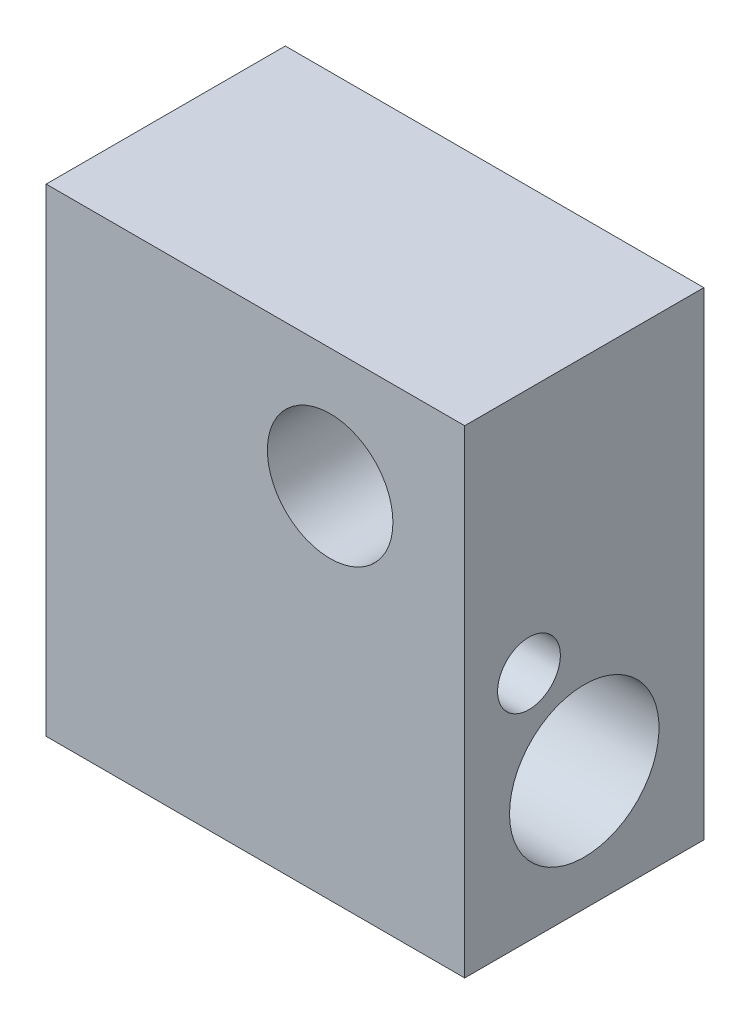
ISO-10303-21;
HEADER;
FILE_DESCRIPTION(('STEP AP214'),'2;1');
FILE_NAME('part.step','',(''),(''),'','','');
FILE_SCHEMA(('AUTOMOTIVE_DESIGN { 1 0 10303 214 1 1 1 1 }'));
ENDSEC;
DATA;
#1=APPLICATION_CONTEXT('core data for automotive mechanical design processes');
#2=APPLICATION_PROTOCOL_DEFINITION('international standard','automotive_design',2000,#1);
#3=PRODUCT_CONTEXT('',#1,'mechanical');
#4=PRODUCT('Part','Part','',(#3));
#5=PRODUCT_RELATED_PRODUCT_CATEGORY('part','',(#4));
#6=PRODUCT_DEFINITION_FORMATION('','',#4);
#7=PRODUCT_DEFINITION_CONTEXT('part definition',#1,'design');
#8=PRODUCT_DEFINITION('design','',#6,#7);
#9=PRODUCT_DEFINITION_SHAPE('','',#8);
#10=(LENGTH_UNIT() NAMED_UNIT(*) SI_UNIT(.MILLI.,.METRE.));
#11=(NAMED_UNIT(*) PLANE_ANGLE_UNIT() SI_UNIT($,.RADIAN.));
#12=(NAMED_UNIT(*) SI_UNIT($,.STERADIAN.) SOLID_ANGLE_UNIT());
#13=UNCERTAINTY_MEASURE_WITH_UNIT(LENGTH_MEASURE(1.E-05),#10,'distance_accuracy_value','');
#14=(GEOMETRIC_REPRESENTATION_CONTEXT(3) GLOBAL_UNCERTAINTY_ASSIGNED_CONTEXT((#13)) GLOBAL_UNIT_ASSIGNED_CONTEXT((#10,
#11,#12)) REPRESENTATION_CONTEXT('',''));
#15=CARTESIAN_POINT('',(0.,0.,0.));
#16=DIRECTION('',(0.,0.,1.));
#17=DIRECTION('',(1.,0.,0.));
#18=AXIS2_PLACEMENT_3D('',#15,#16,#17);
#19=CARTESIAN_POINT('',(0.,0.,8.));
#20=DIRECTION('',(1.,0.,0.));
#21=DIRECTION('',(0.,0.,-1.));
#22=AXIS2_PLACEMENT_3D('',#19,#20,#21);
#23=PLANE('',#22);
#24=CARTESIAN_POINT('',(0.,7.75,5.85));
#25=DIRECTION('',(-1.,0.,0.));
#26=DIRECTION('',(0.,0.,1.));
#27=AXIS2_PLACEMENT_3D('',#24,#25,#26);
#28=CIRCLE('',#27,1.05);
#29=CARTESIAN_POINT('',(0.,7.75,6.9));
#30=VERTEX_POINT('',#29);
#31=EDGE_CURVE('E149',#30,#30,#28,.T.);
#32=ORIENTED_EDGE('',*,*,#31,.F.);
#33=EDGE_LOOP('',(#32));
#34=FACE_BOUND('',#33,.T.);
#35=CARTESIAN_POINT('',(0.,4.,4.));
#36=DIRECTION('',(-1.,0.,0.));
#37=DIRECTION('',(0.,0.,1.));
#38=AXIS2_PLACEMENT_3D('',#35,#36,#37);
#39=CIRCLE('',#38,2.49999999999999);
#40=CARTESIAN_POINT('',(0.,4.,6.49999999999999));
#41=VERTEX_POINT('',#40);
#42=EDGE_CURVE('E142',#41,#41,#39,.T.);
#43=ORIENTED_EDGE('',*,*,#42,.F.);
#44=EDGE_LOOP('',(#43));
#45=FACE_BOUND('',#44,.T.);
#46=DIRECTION('',(0.,-1.,0.));
#47=VECTOR('',#46,1.);
#48=CARTESIAN_POINT('',(0.,0.,0.));
#49=LINE('',#48,#47);
#50=CARTESIAN_POINT('',(0.,16.,0.));
#51=VERTEX_POINT('',#50);
#52=CARTESIAN_POINT('',(0.,0.,0.));
#53=VERTEX_POINT('',#52);
#54=EDGE_CURVE('E110',#51,#53,#49,.T.);
#55=ORIENTED_EDGE('',*,*,#54,.T.);
#56=DIRECTION('',(0.,0.,-1.));
#57=VECTOR('',#56,1.);
#58=CARTESIAN_POINT('',(0.,0.,8.));
#59=LINE('',#58,#57);
#60=CARTESIAN_POINT('',(0.,0.,8.));
#61=VERTEX_POINT('',#60);
#62=EDGE_CURVE('E11',#61,#53,#59,.T.);
#63=ORIENTED_EDGE('',*,*,#62,.F.);
#64=DIRECTION('',(0.,-1.,0.));
#65=VECTOR('',#64,1.);
#66=CARTESIAN_POINT('',(0.,0.,8.));
#67=LINE('',#66,#65);
#68=CARTESIAN_POINT('',(0.,16.,8.));
#69=VERTEX_POINT('',#68);
#70=EDGE_CURVE('E93',#69,#61,#67,.T.);
#71=ORIENTED_EDGE('',*,*,#70,.F.);
#72=DIRECTION('',(0.,0.,-1.));
#73=VECTOR('',#72,1.);
#74=CARTESIAN_POINT('',(0.,16.,8.));
#75=LINE('',#74,#73);
#76=EDGE_CURVE('E106',#69,#51,#75,.T.);
#77=ORIENTED_EDGE('',*,*,#76,.T.);
#78=EDGE_LOOP('',(#55,#63,#71,#77));
#79=FACE_BOUND('',#78,.T.);
#80=ADVANCED_FACE('F38',(#34,#45,#79),#23,.F.);
#81=CARTESIAN_POINT('',(0.,0.,8.));
#82=DIRECTION('',(0.,1.,0.));
#83=DIRECTION('',(0.,0.,1.));
#84=AXIS2_PLACEMENT_3D('',#81,#82,#83);
#85=PLANE('',#84);
#86=DIRECTION('',(1.,0.,0.));
#87=VECTOR('',#86,1.);
#88=CARTESIAN_POINT('',(0.,0.,0.));
#89=LINE('',#88,#87);
#90=CARTESIAN_POINT('',(14.,0.,0.));
#91=VERTEX_POINT('',#90);
#92=EDGE_CURVE('E98',#53,#91,#89,.T.);
#93=ORIENTED_EDGE('',*,*,#92,.T.);
#94=DIRECTION('',(0.,0.,-1.));
#95=VECTOR('',#94,1.);
#96=CARTESIAN_POINT('',(14.,0.,8.));
#97=LINE('',#96,#95);
#98=CARTESIAN_POINT('',(14.,0.,8.));
#99=VERTEX_POINT('',#98);
#100=EDGE_CURVE('E46',#99,#91,#97,.T.);
#101=ORIENTED_EDGE('',*,*,#100,.F.);
#102=DIRECTION('',(1.,0.,0.));
#103=VECTOR('',#102,1.);
#104=CARTESIAN_POINT('',(0.,0.,8.));
#105=LINE('',#104,#103);
#106=EDGE_CURVE('E88',#61,#99,#105,.T.);
#107=ORIENTED_EDGE('',*,*,#106,.F.);
#108=ORIENTED_EDGE('',*,*,#62,.T.);
#109=EDGE_LOOP('',(#93,#101,#107,#108));
#110=FACE_BOUND('',#109,.T.);
#111=ADVANCED_FACE('F97',(#110),#85,.F.);
#112=CARTESIAN_POINT('',(14.,0.,8.));
#113=DIRECTION('',(-1.,0.,0.));
#114=DIRECTION('',(0.,0.,1.));
#115=AXIS2_PLACEMENT_3D('',#112,#113,#114);
#116=PLANE('',#115);
#117=CARTESIAN_POINT('',(14.,7.75,5.85));
#118=DIRECTION('',(-1.,0.,0.));
#119=DIRECTION('',(0.,0.,1.));
#120=AXIS2_PLACEMENT_3D('',#117,#118,#119);
#121=CIRCLE('',#120,1.05);
#122=CARTESIAN_POINT('',(14.,7.75,6.9));
#123=VERTEX_POINT('',#122);
#124=EDGE_CURVE('E146',#123,#123,#121,.T.);
#125=ORIENTED_EDGE('',*,*,#124,.T.);
#126=EDGE_LOOP('',(#125));
#127=FACE_BOUND('',#126,.T.);
#128=CARTESIAN_POINT('',(14.,4.,4.));
#129=DIRECTION('',(-1.,0.,0.));
#130=DIRECTION('',(0.,0.,1.));
#131=AXIS2_PLACEMENT_3D('',#128,#129,#130);
#132=CIRCLE('',#131,2.5);
#133=CARTESIAN_POINT('',(14.,4.,6.5));
#134=VERTEX_POINT('',#133);
#135=EDGE_CURVE('E138',#134,#134,#132,.T.);
#136=ORIENTED_EDGE('',*,*,#135,.T.);
#137=EDGE_LOOP('',(#136));
#138=FACE_BOUND('',#137,.T.);
#139=DIRECTION('',(0.,1.,0.));
#140=VECTOR('',#139,1.);
#141=CARTESIAN_POINT('',(14.,0.,0.));
#142=LINE('',#141,#140);
#143=CARTESIAN_POINT('',(14.,16.,0.));
#144=VERTEX_POINT('',#143);
#145=EDGE_CURVE('E74',#91,#144,#142,.T.);
#146=ORIENTED_EDGE('',*,*,#145,.T.);
#147=DIRECTION('',(0.,0.,-1.));
#148=VECTOR('',#147,1.);
#149=CARTESIAN_POINT('',(14.,16.,8.));
#150=LINE('',#149,#148);
#151=CARTESIAN_POINT('',(14.,16.,8.));
#152=VERTEX_POINT('',#151);
#153=EDGE_CURVE('E100',#152,#144,#150,.T.);
#154=ORIENTED_EDGE('',*,*,#153,.F.);
#155=DIRECTION('',(0.,1.,0.));
#156=VECTOR('',#155,1.);
#157=CARTESIAN_POINT('',(14.,0.,8.));
#158=LINE('',#157,#156);
#159=EDGE_CURVE('E91',#99,#152,#158,.T.);
#160=ORIENTED_EDGE('',*,*,#159,.F.);
#161=ORIENTED_EDGE('',*,*,#100,.T.);
#162=EDGE_LOOP('',(#146,#154,#160,#161));
#163=FACE_BOUND('',#162,.T.);
#164=ADVANCED_FACE('F101',(#127,#138,#163),#116,.F.);
#165=CARTESIAN_POINT('',(0.,16.,8.));
#166=DIRECTION('',(0.,-1.,0.));
#167=DIRECTION('',(0.,0.,-1.));
#168=AXIS2_PLACEMENT_3D('',#165,#166,#167);
#169=PLANE('',#168);
#170=DIRECTION('',(-1.,0.,0.));
#171=VECTOR('',#170,1.);
#172=CARTESIAN_POINT('',(0.,16.,0.));
#173=LINE('',#172,#171);
#174=EDGE_CURVE('E81',#144,#51,#173,.T.);
#175=ORIENTED_EDGE('',*,*,#174,.T.);
#176=ORIENTED_EDGE('',*,*,#76,.F.);
#177=DIRECTION('',(-1.,0.,0.));
#178=VECTOR('',#177,1.);
#179=CARTESIAN_POINT('',(0.,16.,8.));
#180=LINE('',#179,#178);
#181=EDGE_CURVE('E56',#152,#69,#180,.T.);
#182=ORIENTED_EDGE('',*,*,#181,.F.);
#183=ORIENTED_EDGE('',*,*,#153,.T.);
#184=EDGE_LOOP('',(#175,#176,#182,#183));
#185=FACE_BOUND('',#184,.T.);
#186=ADVANCED_FACE('F125',(#185),#169,.F.);
#187=CARTESIAN_POINT('',(0.,16.,8.));
#188=DIRECTION('',(0.,0.,-1.));
#189=DIRECTION('',(-1.,0.,0.));
#190=AXIS2_PLACEMENT_3D('',#187,#188,#189);
#191=PLANE('',#190);
#192=CARTESIAN_POINT('',(9.5,12.,8.));
#193=DIRECTION('',(0.,0.,1.));
#194=DIRECTION('',(1.,0.,0.));
#195=AXIS2_PLACEMENT_3D('',#192,#193,#194);
#196=CIRCLE('',#195,2.09999999999999);
#197=CARTESIAN_POINT('',(11.6,12.,8.));
#198=VERTEX_POINT('',#197);
#199=EDGE_CURVE('E135',#198,#198,#196,.T.);
#200=ORIENTED_EDGE('',*,*,#199,.F.);
#201=EDGE_LOOP('',(#200));
#202=FACE_BOUND('',#201,.T.);
#203=ORIENTED_EDGE('',*,*,#70,.T.);
#204=ORIENTED_EDGE('',*,*,#106,.T.);
#205=ORIENTED_EDGE('',*,*,#159,.T.);
#206=ORIENTED_EDGE('',*,*,#181,.T.);
#207=EDGE_LOOP('',(#203,#204,#205,#206));
#208=FACE_BOUND('',#207,.T.);
#209=ADVANCED_FACE('F89',(#202,#208),#191,.F.);
#210=CARTESIAN_POINT('',(0.,16.,0.));
#211=DIRECTION('',(0.,0.,-1.));
#212=DIRECTION('',(-1.,0.,0.));
#213=AXIS2_PLACEMENT_3D('',#210,#211,#212);
#214=PLANE('',#213);
#215=CARTESIAN_POINT('',(9.5,12.,0.));
#216=DIRECTION('',(0.,0.,1.));
#217=DIRECTION('',(1.,0.,0.));
#218=AXIS2_PLACEMENT_3D('',#215,#216,#217);
#219=CIRCLE('',#218,2.1);
#220=CARTESIAN_POINT('',(11.6,12.,0.));
#221=VERTEX_POINT('',#220);
#222=EDGE_CURVE('E114',#221,#221,#219,.T.);
#223=ORIENTED_EDGE('',*,*,#222,.T.);
#224=EDGE_LOOP('',(#223));
#225=FACE_BOUND('',#224,.T.);
#226=ORIENTED_EDGE('',*,*,#54,.F.);
#227=ORIENTED_EDGE('',*,*,#174,.F.);
#228=ORIENTED_EDGE('',*,*,#145,.F.);
#229=ORIENTED_EDGE('',*,*,#92,.F.);
#230=EDGE_LOOP('',(#226,#227,#228,#229));
#231=FACE_BOUND('',#230,.T.);
#232=ADVANCED_FACE('F128',(#225,#231),#214,.T.);
#233=CARTESIAN_POINT('',(9.5,12.,8.));
#234=DIRECTION('',(0.,0.,1.));
#235=DIRECTION('',(1.,0.,0.));
#236=AXIS2_PLACEMENT_3D('',#233,#234,#235);
#237=CYLINDRICAL_SURFACE('',#236,2.09999999999999);
#238=ORIENTED_EDGE('',*,*,#222,.F.);
#239=EDGE_LOOP('',(#238));
#240=FACE_BOUND('',#239,.T.);
#241=ORIENTED_EDGE('',*,*,#199,.T.);
#242=EDGE_LOOP('',(#241));
#243=FACE_BOUND('',#242,.T.);
#244=ADVANCED_FACE('F162',(#240,#243),#237,.F.);
#245=CARTESIAN_POINT('',(0.,4.,4.));
#246=DIRECTION('',(-1.,0.,0.));
#247=DIRECTION('',(0.,0.,1.));
#248=AXIS2_PLACEMENT_3D('',#245,#246,#247);
#249=CYLINDRICAL_SURFACE('',#248,2.49999999999999);
#250=ORIENTED_EDGE('',*,*,#135,.F.);
#251=EDGE_LOOP('',(#250));
#252=FACE_BOUND('',#251,.T.);
#253=ORIENTED_EDGE('',*,*,#42,.T.);
#254=EDGE_LOOP('',(#253));
#255=FACE_BOUND('',#254,.T.);
#256=ADVANCED_FACE('F160',(#252,#255),#249,.F.);
#257=CARTESIAN_POINT('',(0.,7.75,5.85));
#258=DIRECTION('',(-1.,0.,0.));
#259=DIRECTION('',(0.,0.,1.));
#260=AXIS2_PLACEMENT_3D('',#257,#258,#259);
#261=CYLINDRICAL_SURFACE('',#260,1.05);
#262=ORIENTED_EDGE('',*,*,#124,.F.);
#263=EDGE_LOOP('',(#262));
#264=FACE_BOUND('',#263,.T.);
#265=ORIENTED_EDGE('',*,*,#31,.T.);
#266=EDGE_LOOP('',(#265));
#267=FACE_BOUND('',#266,.T.);
#268=ADVANCED_FACE('F154',(#264,#267),#261,.F.);
#269=CLOSED_SHELL('',(#80,#111,#164,#186,#209,#232,#244,#256,#268));
#270=MANIFOLD_SOLID_BREP('B2',#269);
#271=ADVANCED_BREP_SHAPE_REPRESENTATION('',(#18,#270),#14);
#272=SHAPE_DEFINITION_REPRESENTATION(#9,#271);
ENDSEC;
END-ISO-10303-21;
